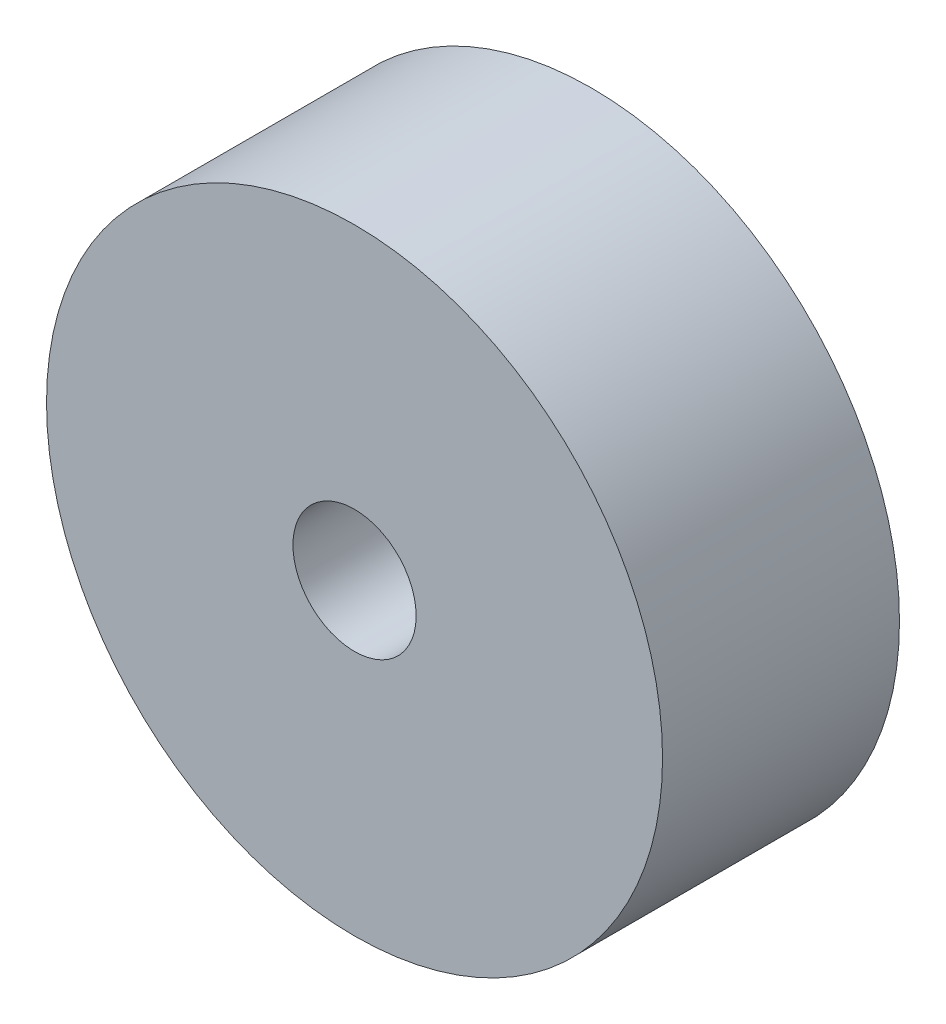
ISO-10303-21;
HEADER;
FILE_DESCRIPTION(('STEP AP214'),'2;1');
FILE_NAME('part.step','',(''),(''),'','','');
FILE_SCHEMA(('AUTOMOTIVE_DESIGN { 1 0 10303 214 1 1 1 1 }'));
ENDSEC;
DATA;
#1=APPLICATION_CONTEXT('core data for automotive mechanical design processes');
#2=APPLICATION_PROTOCOL_DEFINITION('international standard','automotive_design',2000,#1);
#3=PRODUCT_CONTEXT('',#1,'mechanical');
#4=PRODUCT('Part','Part','',(#3));
#5=PRODUCT_RELATED_PRODUCT_CATEGORY('part','',(#4));
#6=PRODUCT_DEFINITION_FORMATION('','',#4);
#7=PRODUCT_DEFINITION_CONTEXT('part definition',#1,'design');
#8=PRODUCT_DEFINITION('design','',#6,#7);
#9=PRODUCT_DEFINITION_SHAPE('','',#8);
#10=(LENGTH_UNIT() NAMED_UNIT(*) SI_UNIT(.MILLI.,.METRE.));
#11=(NAMED_UNIT(*) PLANE_ANGLE_UNIT() SI_UNIT($,.RADIAN.));
#12=(NAMED_UNIT(*) SI_UNIT($,.STERADIAN.) SOLID_ANGLE_UNIT());
#13=UNCERTAINTY_MEASURE_WITH_UNIT(LENGTH_MEASURE(1.E-05),#10,'distance_accuracy_value','');
#14=(GEOMETRIC_REPRESENTATION_CONTEXT(3) GLOBAL_UNCERTAINTY_ASSIGNED_CONTEXT((#13)) GLOBAL_UNIT_ASSIGNED_CONTEXT((#10,
#11,#12)) REPRESENTATION_CONTEXT('',''));
#15=CARTESIAN_POINT('',(0.,0.,0.));
#16=DIRECTION('',(0.,0.,1.));
#17=DIRECTION('',(1.,0.,0.));
#18=AXIS2_PLACEMENT_3D('',#15,#16,#17);
#19=CARTESIAN_POINT('',(0.,0.,5.));
#20=DIRECTION('',(0.,0.,1.));
#21=DIRECTION('',(1.,0.,0.));
#22=AXIS2_PLACEMENT_3D('',#19,#20,#21);
#23=PLANE('',#22);
#24=CARTESIAN_POINT('',(0.,0.,5.));
#25=DIRECTION('',(0.,0.,1.));
#26=DIRECTION('',(1.,0.,0.));
#27=AXIS2_PLACEMENT_3D('',#24,#25,#26);
#28=CIRCLE('',#27,6.5);
#29=CARTESIAN_POINT('',(6.5,0.,5.));
#30=VERTEX_POINT('',#29);
#31=EDGE_CURVE('E10',#30,#30,#28,.T.);
#32=ORIENTED_EDGE('',*,*,#31,.T.);
#33=EDGE_LOOP('',(#32));
#34=FACE_BOUND('',#33,.T.);
#35=CARTESIAN_POINT('',(0.,0.,5.));
#36=DIRECTION('',(0.,0.,1.));
#37=DIRECTION('',(1.,0.,0.));
#38=AXIS2_PLACEMENT_3D('',#35,#36,#37);
#39=CIRCLE('',#38,1.3);
#40=CARTESIAN_POINT('',(1.3,0.,5.));
#41=VERTEX_POINT('',#40);
#42=EDGE_CURVE('E44',#41,#41,#39,.T.);
#43=ORIENTED_EDGE('',*,*,#42,.F.);
#44=EDGE_LOOP('',(#43));
#45=FACE_BOUND('',#44,.T.);
#46=ADVANCED_FACE('F33',(#34,#45),#23,.T.);
#47=CARTESIAN_POINT('',(0.,0.,0.));
#48=DIRECTION('',(0.,0.,1.));
#49=DIRECTION('',(1.,0.,0.));
#50=AXIS2_PLACEMENT_3D('',#47,#48,#49);
#51=PLANE('',#50);
#52=CARTESIAN_POINT('',(0.,0.,0.));
#53=DIRECTION('',(0.,0.,1.));
#54=DIRECTION('',(1.,0.,0.));
#55=AXIS2_PLACEMENT_3D('',#52,#53,#54);
#56=CIRCLE('',#55,6.5);
#57=CARTESIAN_POINT('',(6.5,0.,0.));
#58=VERTEX_POINT('',#57);
#59=EDGE_CURVE('E37',#58,#58,#56,.T.);
#60=ORIENTED_EDGE('',*,*,#59,.F.);
#61=EDGE_LOOP('',(#60));
#62=FACE_BOUND('',#61,.T.);
#63=CARTESIAN_POINT('',(0.,0.,0.));
#64=DIRECTION('',(0.,0.,1.));
#65=DIRECTION('',(1.,0.,0.));
#66=AXIS2_PLACEMENT_3D('',#63,#64,#65);
#67=CIRCLE('',#66,1.3);
#68=CARTESIAN_POINT('',(1.3,0.,0.));
#69=VERTEX_POINT('',#68);
#70=EDGE_CURVE('E46',#69,#69,#67,.T.);
#71=ORIENTED_EDGE('',*,*,#70,.T.);
#72=EDGE_LOOP('',(#71));
#73=FACE_BOUND('',#72,.T.);
#74=ADVANCED_FACE('F56',(#62,#73),#51,.F.);
#75=CARTESIAN_POINT('',(0.,0.,5.));
#76=DIRECTION('',(0.,0.,-1.));
#77=DIRECTION('',(-1.,0.,0.));
#78=AXIS2_PLACEMENT_3D('',#75,#76,#77);
#79=CYLINDRICAL_SURFACE('',#78,6.5);
#80=ORIENTED_EDGE('',*,*,#31,.F.);
#81=EDGE_LOOP('',(#80));
#82=FACE_BOUND('',#81,.T.);
#83=ORIENTED_EDGE('',*,*,#59,.T.);
#84=EDGE_LOOP('',(#83));
#85=FACE_BOUND('',#84,.T.);
#86=ADVANCED_FACE('F35',(#82,#85),#79,.T.);
#87=CARTESIAN_POINT('',(0.,0.,5.));
#88=DIRECTION('',(0.,0.,-1.));
#89=DIRECTION('',(-1.,0.,0.));
#90=AXIS2_PLACEMENT_3D('',#87,#88,#89);
#91=CYLINDRICAL_SURFACE('',#90,1.3);
#92=ORIENTED_EDGE('',*,*,#42,.T.);
#93=EDGE_LOOP('',(#92));
#94=FACE_BOUND('',#93,.T.);
#95=ORIENTED_EDGE('',*,*,#70,.F.);
#96=EDGE_LOOP('',(#95));
#97=FACE_BOUND('',#96,.T.);
#98=ADVANCED_FACE('F52',(#94,#97),#91,.F.);
#99=CLOSED_SHELL('',(#46,#74,#86,#98));
#100=MANIFOLD_SOLID_BREP('B2',#99);
#101=ADVANCED_BREP_SHAPE_REPRESENTATION('',(#18,#100),#14);
#102=SHAPE_DEFINITION_REPRESENTATION(#9,#101);
ENDSEC;
END-ISO-10303-21;
